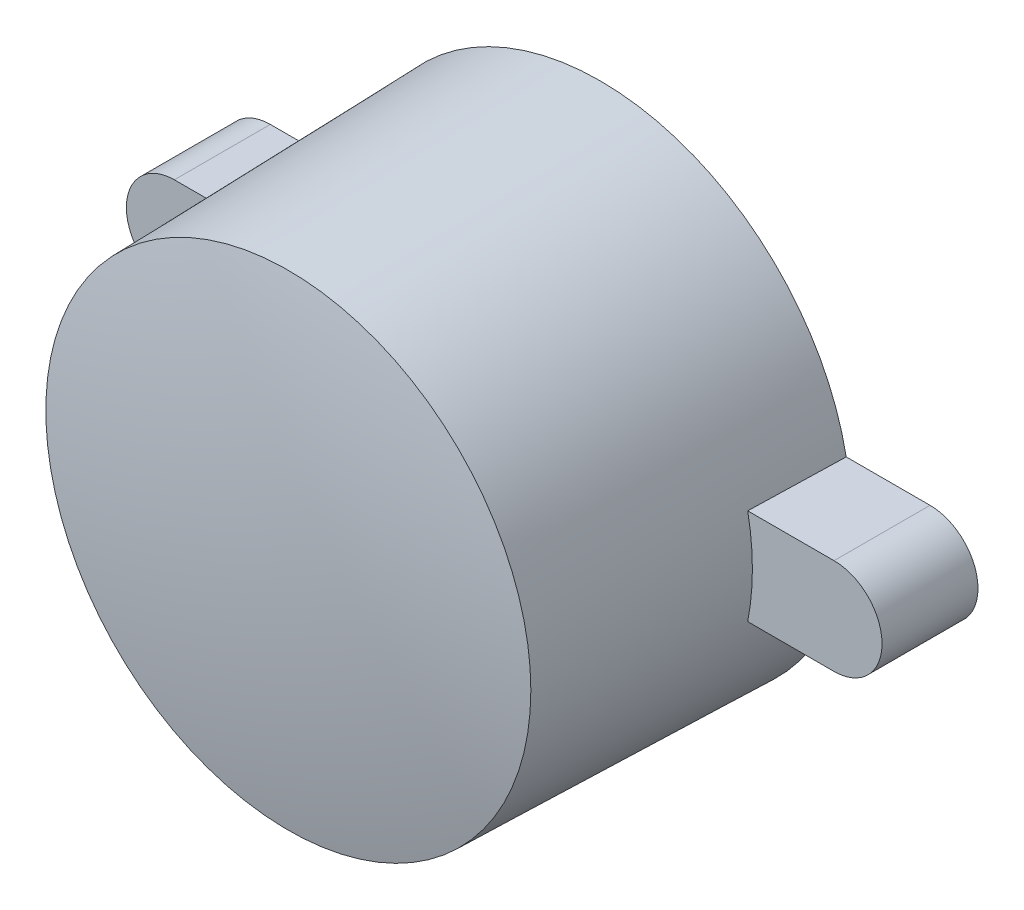
ISO-10303-21;
HEADER;
FILE_DESCRIPTION(('STEP AP214'),'2;1');
FILE_NAME('part.step','',(''),(''),'','','');
FILE_SCHEMA(('AUTOMOTIVE_DESIGN { 1 0 10303 214 1 1 1 1 }'));
ENDSEC;
DATA;
#1=APPLICATION_CONTEXT('core data for automotive mechanical design processes');
#2=APPLICATION_PROTOCOL_DEFINITION('international standard','automotive_design',2000,#1);
#3=PRODUCT_CONTEXT('',#1,'mechanical');
#4=PRODUCT('Part','Part','',(#3));
#5=PRODUCT_RELATED_PRODUCT_CATEGORY('part','',(#4));
#6=PRODUCT_DEFINITION_FORMATION('','',#4);
#7=PRODUCT_DEFINITION_CONTEXT('part definition',#1,'design');
#8=PRODUCT_DEFINITION('design','',#6,#7);
#9=PRODUCT_DEFINITION_SHAPE('','',#8);
#10=(LENGTH_UNIT() NAMED_UNIT(*) SI_UNIT(.MILLI.,.METRE.));
#11=(NAMED_UNIT(*) PLANE_ANGLE_UNIT() SI_UNIT($,.RADIAN.));
#12=(NAMED_UNIT(*) SI_UNIT($,.STERADIAN.) SOLID_ANGLE_UNIT());
#13=UNCERTAINTY_MEASURE_WITH_UNIT(LENGTH_MEASURE(1.E-05),#10,'distance_accuracy_value','');
#14=(GEOMETRIC_REPRESENTATION_CONTEXT(3) GLOBAL_UNCERTAINTY_ASSIGNED_CONTEXT((#13)) GLOBAL_UNIT_ASSIGNED_CONTEXT((#10,
#11,#12)) REPRESENTATION_CONTEXT('',''));
#15=CARTESIAN_POINT('',(0.,0.,0.));
#16=DIRECTION('',(0.,0.,1.));
#17=DIRECTION('',(1.,0.,0.));
#18=AXIS2_PLACEMENT_3D('',#15,#16,#17);
#19=CARTESIAN_POINT('',(0.,0.,0.));
#20=DIRECTION('',(0.,0.,-1.));
#21=DIRECTION('',(1.,0.,0.));
#22=AXIS2_PLACEMENT_3D('',#19,#20,#21);
#23=CONICAL_SURFACE('',#22,5.22500000000001,0.026179938779915);
#24=CARTESIAN_POINT('',(0.,0.,6.5));
#25=DIRECTION('',(0.,0.,1.));
#26=DIRECTION('',(1.,0.,0.));
#27=AXIS2_PLACEMENT_3D('',#24,#25,#26);
#28=CIRCLE('',#27,5.05479150980029);
#29=CARTESIAN_POINT('',(5.05479150980029,0.,6.5));
#30=VERTEX_POINT('',#29);
#31=EDGE_CURVE('E183',#30,#30,#28,.T.);
#32=ORIENTED_EDGE('',*,*,#31,.F.);
#33=EDGE_LOOP('',(#32));
#34=FACE_BOUND('',#33,.T.);
#35=CARTESIAN_POINT('',(0.,0.,2.));
#36=DIRECTION('',(0.,0.,-1.));
#37=DIRECTION('',(-1.,0.,0.));
#38=AXIS2_PLACEMENT_3D('',#35,#36,#37);
#39=CIRCLE('',#38,5.17262815686163);
#40=CARTESIAN_POINT('',(-5.0750450292739,-0.999999999999997,2.));
#41=VERTEX_POINT('',#40);
#42=CARTESIAN_POINT('',(-5.07504502927391,1.,2.));
#43=VERTEX_POINT('',#42);
#44=EDGE_CURVE('E11',#41,#43,#39,.T.);
#45=ORIENTED_EDGE('',*,*,#44,.F.);
#46=CARTESIAN_POINT('',(-4.98771234034426,-0.999999999999998,5.27111321483177));
#47=CARTESIAN_POINT('',(-5.03237903859328,-0.999999999999998,3.59860096085771));
#48=CARTESIAN_POINT('',(-5.07702432137998,-0.999999999999998,1.92608813550363));
#49=CARTESIAN_POINT('',(-5.16627205602835,-0.999999999999998,-1.41893865795026));
#50=CARTESIAN_POINT('',(-5.21087450789002,-0.999999999999998,-3.09145262605006));
#51=CARTESIAN_POINT('',(-5.25545554428937,-0.999999999999998,-4.76396716552988));
#52=B_SPLINE_CURVE_WITH_KNOTS('',3,(#46,#47,#48,#49,#50,#51),.UNSPECIFIED.,.F.,.F.,(4,2,4),(0.,
5.01932576849132,10.0386515369396),.UNSPECIFIED.);
#53=CARTESIAN_POINT('',(-5.12841349736935,-0.999999999999998,0.));
#54=VERTEX_POINT('',#53);
#55=EDGE_CURVE('E131',#41,#54,#52,.T.);
#56=ORIENTED_EDGE('',*,*,#55,.T.);
#57=CARTESIAN_POINT('',(0.,0.,0.));
#58=DIRECTION('',(0.,0.,1.));
#59=DIRECTION('',(1.,0.,0.));
#60=AXIS2_PLACEMENT_3D('',#57,#58,#59);
#61=CIRCLE('',#60,5.22500000000001);
#62=CARTESIAN_POINT('',(5.12841349736935,-1.,0.));
#63=VERTEX_POINT('',#62);
#64=EDGE_CURVE('E178',#54,#63,#61,.T.);
#65=ORIENTED_EDGE('',*,*,#64,.T.);
#66=CARTESIAN_POINT('',(5.25545554428937,-1.,-4.76396716552988));
#67=CARTESIAN_POINT('',(5.21087450789002,-1.,-3.09145262605006));
#68=CARTESIAN_POINT('',(5.16627205602835,-1.,-1.41893865795025));
#69=CARTESIAN_POINT('',(5.07702432137998,-1.,1.92608813550363));
#70=CARTESIAN_POINT('',(5.03237903859328,-1.,3.59860096085771));
#71=CARTESIAN_POINT('',(4.98771234034426,-1.,5.27111321483177));
#72=B_SPLINE_CURVE_WITH_KNOTS('',3,(#66,#67,#68,#69,#70,#71),.UNSPECIFIED.,.F.,.F.,(4,2,4),(0.,
5.0193257684483,10.0386515369396),.UNSPECIFIED.);
#73=CARTESIAN_POINT('',(5.0750450292739,-0.999999999999999,2.));
#74=VERTEX_POINT('',#73);
#75=EDGE_CURVE('E170',#63,#74,#72,.T.);
#76=ORIENTED_EDGE('',*,*,#75,.T.);
#77=CARTESIAN_POINT('',(0.,0.,2.));
#78=DIRECTION('',(0.,0.,-1.));
#79=DIRECTION('',(-1.,0.,0.));
#80=AXIS2_PLACEMENT_3D('',#77,#78,#79);
#81=CIRCLE('',#80,5.17262815686163);
#82=CARTESIAN_POINT('',(5.07504502927391,1.,2.));
#83=VERTEX_POINT('',#82);
#84=EDGE_CURVE('E41',#83,#74,#81,.T.);
#85=ORIENTED_EDGE('',*,*,#84,.F.);
#86=CARTESIAN_POINT('',(4.98771234034426,1.,5.27111321483177));
#87=CARTESIAN_POINT('',(5.03237903859328,1.,3.59860096085771));
#88=CARTESIAN_POINT('',(5.07702432137998,1.,1.92608813550363));
#89=CARTESIAN_POINT('',(5.16627205602835,1.,-1.41893865795026));
#90=CARTESIAN_POINT('',(5.21087450789002,1.,-3.09145262605006));
#91=CARTESIAN_POINT('',(5.25545554428937,1.,-4.76396716552988));
#92=B_SPLINE_CURVE_WITH_KNOTS('',3,(#86,#87,#88,#89,#90,#91),.UNSPECIFIED.,.F.,.F.,(4,2,4),(0.,
5.01932576849132,10.0386515369396),.UNSPECIFIED.);
#93=CARTESIAN_POINT('',(5.12841349736934,1.,0.));
#94=VERTEX_POINT('',#93);
#95=EDGE_CURVE('E162',#83,#94,#92,.T.);
#96=ORIENTED_EDGE('',*,*,#95,.T.);
#97=CARTESIAN_POINT('',(-5.12841349736934,1.,0.));
#98=VERTEX_POINT('',#97);
#99=EDGE_CURVE('E181',#94,#98,#61,.T.);
#100=ORIENTED_EDGE('',*,*,#99,.T.);
#101=CARTESIAN_POINT('',(-5.25545554428937,1.,-4.76396716552988));
#102=CARTESIAN_POINT('',(-5.21087450789002,1.,-3.09145262605006));
#103=CARTESIAN_POINT('',(-5.16627205602835,1.,-1.41893865795025));
#104=CARTESIAN_POINT('',(-5.07702432137998,1.,1.92608813550363));
#105=CARTESIAN_POINT('',(-5.03237903859328,1.,3.59860096085771));
#106=CARTESIAN_POINT('',(-4.98771234034426,1.,5.27111321483177));
#107=B_SPLINE_CURVE_WITH_KNOTS('',3,(#101,#102,#103,#104,#105,#106),.UNSPECIFIED.,.F.,.F.,(4,2,
4),(0.,5.0193257684483,10.0386515369396),.UNSPECIFIED.);
#108=EDGE_CURVE('E48',#98,#43,#107,.T.);
#109=ORIENTED_EDGE('',*,*,#108,.T.);
#110=EDGE_LOOP('',(#45,#56,#65,#76,#85,#96,#100,#109));
#111=FACE_BOUND('',#110,.T.);
#112=ADVANCED_FACE('F33',(#34,#111),#23,.T.);
#113=CARTESIAN_POINT('',(0.,0.,-18.8009172075491));
#114=DIRECTION('',(0.,0.,1.));
#115=DIRECTION('',(1.,0.,0.));
#116=AXIS2_PLACEMENT_3D('',#113,#114,#115);
#117=SPHERICAL_SURFACE('',#116,25.8009172075491);
#118=ORIENTED_EDGE('',*,*,#31,.T.);
#119=EDGE_LOOP('',(#118));
#120=FACE_BOUND('',#119,.T.);
#121=ADVANCED_FACE('F35',(#120),#117,.T.);
#122=CARTESIAN_POINT('',(0.,0.,0.));
#123=DIRECTION('',(0.,0.,1.));
#124=DIRECTION('',(1.,0.,0.));
#125=AXIS2_PLACEMENT_3D('',#122,#123,#124);
#126=PLANE('',#125);
#127=CARTESIAN_POINT('',(0.,0.,0.));
#128=DIRECTION('',(0.,0.,1.));
#129=DIRECTION('',(1.,0.,0.));
#130=AXIS2_PLACEMENT_3D('',#127,#128,#129);
#131=CIRCLE('',#130,3.47440011314099);
#132=CARTESIAN_POINT('',(3.47440011314099,0.,0.));
#133=VERTEX_POINT('',#132);
#134=EDGE_CURVE('E169',#133,#133,#131,.T.);
#135=ORIENTED_EDGE('',*,*,#134,.T.);
#136=EDGE_LOOP('',(#135));
#137=FACE_BOUND('',#136,.T.);
#138=ORIENTED_EDGE('',*,*,#64,.F.);
#139=DIRECTION('',(-1.,0.,0.));
#140=VECTOR('',#139,1.);
#141=CARTESIAN_POINT('',(-3.32737977186165,-0.999999999999998,0.));
#142=LINE('',#141,#140);
#143=CARTESIAN_POINT('',(-6.875,-0.999999999999997,0.));
#144=VERTEX_POINT('',#143);
#145=EDGE_CURVE('E117',#54,#144,#142,.T.);
#146=ORIENTED_EDGE('',*,*,#145,.T.);
#147=CARTESIAN_POINT('',(-6.875,0.,0.));
#148=DIRECTION('',(0.,0.,-1.));
#149=DIRECTION('',(-1.,0.,0.));
#150=AXIS2_PLACEMENT_3D('',#147,#148,#149);
#151=CIRCLE('',#150,1.);
#152=CARTESIAN_POINT('',(-6.875,1.,0.));
#153=VERTEX_POINT('',#152);
#154=EDGE_CURVE('E122',#144,#153,#151,.T.);
#155=ORIENTED_EDGE('',*,*,#154,.T.);
#156=DIRECTION('',(1.,0.,0.));
#157=VECTOR('',#156,1.);
#158=CARTESIAN_POINT('',(-3.32737977186165,1.,0.));
#159=LINE('',#158,#157);
#160=EDGE_CURVE('E100',#153,#98,#159,.T.);
#161=ORIENTED_EDGE('',*,*,#160,.T.);
#162=ORIENTED_EDGE('',*,*,#99,.F.);
#163=DIRECTION('',(1.,0.,0.));
#164=VECTOR('',#163,1.);
#165=CARTESIAN_POINT('',(6.875,1.,0.));
#166=LINE('',#165,#164);
#167=CARTESIAN_POINT('',(6.875,1.,0.));
#168=VERTEX_POINT('',#167);
#169=EDGE_CURVE('E202',#94,#168,#166,.T.);
#170=ORIENTED_EDGE('',*,*,#169,.T.);
#171=CARTESIAN_POINT('',(6.875,0.,0.));
#172=DIRECTION('',(0.,0.,-1.));
#173=DIRECTION('',(-1.,0.,0.));
#174=AXIS2_PLACEMENT_3D('',#171,#172,#173);
#175=CIRCLE('',#174,1.);
#176=CARTESIAN_POINT('',(6.875,-1.,0.));
#177=VERTEX_POINT('',#176);
#178=EDGE_CURVE('E204',#168,#177,#175,.T.);
#179=ORIENTED_EDGE('',*,*,#178,.T.);
#180=DIRECTION('',(-1.,0.,0.));
#181=VECTOR('',#180,1.);
#182=CARTESIAN_POINT('',(6.875,-1.,0.));
#183=LINE('',#182,#181);
#184=EDGE_CURVE('E207',#177,#63,#183,.T.);
#185=ORIENTED_EDGE('',*,*,#184,.T.);
#186=EDGE_LOOP('',(#138,#146,#155,#161,#162,#170,#179,#185));
#187=FACE_BOUND('',#186,.T.);
#188=ADVANCED_FACE('F216',(#137,#187),#126,.F.);
#189=CARTESIAN_POINT('',(0.,0.,-0.0458096595387781));
#190=DIRECTION('',(0.,0.,-1.));
#191=DIRECTION('',(1.,0.,0.));
#192=AXIS2_PLACEMENT_3D('',#189,#190,#191);
#193=CONICAL_SURFACE('',#192,3.47559968129278,0.026179938779915);
#194=CARTESIAN_POINT('',(0.,0.,5.01652844704856));
#195=DIRECTION('',(0.,0.,-1.));
#196=DIRECTION('',(-1.,0.,0.));
#197=AXIS2_PLACEMENT_3D('',#194,#195,#196);
#198=CIRCLE('',#197,3.34303769267698);
#199=CARTESIAN_POINT('',(-3.34303769267698,0.,5.01652844704856));
#200=VERTEX_POINT('',#199);
#201=EDGE_CURVE('E175',#200,#200,#198,.F.);
#202=ORIENTED_EDGE('',*,*,#201,.T.);
#203=EDGE_LOOP('',(#202));
#204=FACE_BOUND('',#203,.T.);
#205=ORIENTED_EDGE('',*,*,#134,.F.);
#206=EDGE_LOOP('',(#205));
#207=FACE_BOUND('',#206,.T.);
#208=ADVANCED_FACE('F233',(#204,#207),#193,.F.);
#209=CARTESIAN_POINT('',(0.,0.,-18.8009172075491));
#210=DIRECTION('',(0.,0.,1.));
#211=DIRECTION('',(1.,0.,0.));
#212=AXIS2_PLACEMENT_3D('',#209,#210,#211);
#213=SPHERICAL_SURFACE('',#212,24.0509172075491);
#214=ORIENTED_EDGE('',*,*,#201,.F.);
#215=EDGE_LOOP('',(#214));
#216=FACE_BOUND('',#215,.T.);
#217=ADVANCED_FACE('F157',(#216),#213,.F.);
#218=CARTESIAN_POINT('',(6.875,1.,2.));
#219=DIRECTION('',(0.,1.,0.));
#220=DIRECTION('',(-1.,0.,0.));
#221=AXIS2_PLACEMENT_3D('',#218,#219,#220);
#222=PLANE('',#221);
#223=ORIENTED_EDGE('',*,*,#95,.F.);
#224=DIRECTION('',(1.,0.,0.));
#225=VECTOR('',#224,1.);
#226=CARTESIAN_POINT('',(6.875,1.,2.));
#227=LINE('',#226,#225);
#228=CARTESIAN_POINT('',(6.875,1.,2.));
#229=VERTEX_POINT('',#228);
#230=EDGE_CURVE('E192',#83,#229,#227,.T.);
#231=ORIENTED_EDGE('',*,*,#230,.T.);
#232=DIRECTION('',(0.,0.,-1.));
#233=VECTOR('',#232,1.);
#234=CARTESIAN_POINT('',(6.875,1.,2.));
#235=LINE('',#234,#233);
#236=EDGE_CURVE('E210',#229,#168,#235,.T.);
#237=ORIENTED_EDGE('',*,*,#236,.T.);
#238=ORIENTED_EDGE('',*,*,#169,.F.);
#239=EDGE_LOOP('',(#223,#231,#237,#238));
#240=FACE_BOUND('',#239,.T.);
#241=ADVANCED_FACE('F152',(#240),#222,.T.);
#242=CARTESIAN_POINT('',(6.875,-1.,2.));
#243=DIRECTION('',(0.,-1.,0.));
#244=DIRECTION('',(1.,0.,0.));
#245=AXIS2_PLACEMENT_3D('',#242,#243,#244);
#246=PLANE('',#245);
#247=ORIENTED_EDGE('',*,*,#75,.F.);
#248=ORIENTED_EDGE('',*,*,#184,.F.);
#249=DIRECTION('',(0.,0.,-1.));
#250=VECTOR('',#249,1.);
#251=CARTESIAN_POINT('',(6.875,-1.,2.));
#252=LINE('',#251,#250);
#253=CARTESIAN_POINT('',(6.875,-1.,2.));
#254=VERTEX_POINT('',#253);
#255=EDGE_CURVE('E198',#254,#177,#252,.T.);
#256=ORIENTED_EDGE('',*,*,#255,.F.);
#257=DIRECTION('',(-1.,0.,0.));
#258=VECTOR('',#257,1.);
#259=CARTESIAN_POINT('',(6.875,-1.,2.));
#260=LINE('',#259,#258);
#261=EDGE_CURVE('E190',#254,#74,#260,.T.);
#262=ORIENTED_EDGE('',*,*,#261,.T.);
#263=EDGE_LOOP('',(#247,#248,#256,#262));
#264=FACE_BOUND('',#263,.T.);
#265=ADVANCED_FACE('F156',(#264),#246,.T.);
#266=CARTESIAN_POINT('',(6.875,0.,2.));
#267=DIRECTION('',(0.,0.,-1.));
#268=DIRECTION('',(-1.,0.,0.));
#269=AXIS2_PLACEMENT_3D('',#266,#267,#268);
#270=CYLINDRICAL_SURFACE('',#269,1.);
#271=ORIENTED_EDGE('',*,*,#178,.F.);
#272=ORIENTED_EDGE('',*,*,#236,.F.);
#273=CARTESIAN_POINT('',(6.875,0.,2.));
#274=DIRECTION('',(0.,0.,-1.));
#275=DIRECTION('',(-1.,0.,0.));
#276=AXIS2_PLACEMENT_3D('',#273,#274,#275);
#277=CIRCLE('',#276,1.);
#278=EDGE_CURVE('E199',#229,#254,#277,.T.);
#279=ORIENTED_EDGE('',*,*,#278,.T.);
#280=ORIENTED_EDGE('',*,*,#255,.T.);
#281=EDGE_LOOP('',(#271,#272,#279,#280));
#282=FACE_BOUND('',#281,.T.);
#283=ADVANCED_FACE('F150',(#282),#270,.T.);
#284=CARTESIAN_POINT('',(6.875,0.,2.));
#285=DIRECTION('',(0.,0.,-1.));
#286=DIRECTION('',(-1.,0.,0.));
#287=AXIS2_PLACEMENT_3D('',#284,#285,#286);
#288=PLANE('',#287);
#289=ORIENTED_EDGE('',*,*,#230,.F.);
#290=ORIENTED_EDGE('',*,*,#84,.T.);
#291=ORIENTED_EDGE('',*,*,#261,.F.);
#292=ORIENTED_EDGE('',*,*,#278,.F.);
#293=EDGE_LOOP('',(#289,#290,#291,#292));
#294=FACE_BOUND('',#293,.T.);
#295=ADVANCED_FACE('F147',(#294),#288,.F.);
#296=CARTESIAN_POINT('',(-3.32737977186165,-0.999999999999998,2.));
#297=DIRECTION('',(0.,-1.,0.));
#298=DIRECTION('',(1.,0.,0.));
#299=AXIS2_PLACEMENT_3D('',#296,#297,#298);
#300=PLANE('',#299);
#301=ORIENTED_EDGE('',*,*,#55,.F.);
#302=DIRECTION('',(-1.,0.,0.));
#303=VECTOR('',#302,1.);
#304=CARTESIAN_POINT('',(-3.32737977186165,-0.999999999999998,2.));
#305=LINE('',#304,#303);
#306=CARTESIAN_POINT('',(-6.875,-0.999999999999997,2.));
#307=VERTEX_POINT('',#306);
#308=EDGE_CURVE('E106',#41,#307,#305,.T.);
#309=ORIENTED_EDGE('',*,*,#308,.T.);
#310=DIRECTION('',(0.,0.,-1.));
#311=VECTOR('',#310,1.);
#312=CARTESIAN_POINT('',(-6.875,-0.999999999999997,2.));
#313=LINE('',#312,#311);
#314=EDGE_CURVE('E105',#307,#144,#313,.T.);
#315=ORIENTED_EDGE('',*,*,#314,.T.);
#316=ORIENTED_EDGE('',*,*,#145,.F.);
#317=EDGE_LOOP('',(#301,#309,#315,#316));
#318=FACE_BOUND('',#317,.T.);
#319=ADVANCED_FACE('F142',(#318),#300,.T.);
#320=CARTESIAN_POINT('',(-3.32737977186165,1.,2.));
#321=DIRECTION('',(0.,1.,0.));
#322=DIRECTION('',(-1.,0.,0.));
#323=AXIS2_PLACEMENT_3D('',#320,#321,#322);
#324=PLANE('',#323);
#325=ORIENTED_EDGE('',*,*,#108,.F.);
#326=ORIENTED_EDGE('',*,*,#160,.F.);
#327=DIRECTION('',(0.,0.,-1.));
#328=VECTOR('',#327,1.);
#329=CARTESIAN_POINT('',(-6.875,1.,2.));
#330=LINE('',#329,#328);
#331=CARTESIAN_POINT('',(-6.875,1.,2.));
#332=VERTEX_POINT('',#331);
#333=EDGE_CURVE('E95',#332,#153,#330,.T.);
#334=ORIENTED_EDGE('',*,*,#333,.F.);
#335=DIRECTION('',(1.,0.,0.));
#336=VECTOR('',#335,1.);
#337=CARTESIAN_POINT('',(-3.32737977186165,1.,2.));
#338=LINE('',#337,#336);
#339=EDGE_CURVE('E98',#332,#43,#338,.T.);
#340=ORIENTED_EDGE('',*,*,#339,.T.);
#341=EDGE_LOOP('',(#325,#326,#334,#340));
#342=FACE_BOUND('',#341,.T.);
#343=ADVANCED_FACE('F97',(#342),#324,.T.);
#344=CARTESIAN_POINT('',(-6.875,0.,2.));
#345=DIRECTION('',(0.,0.,-1.));
#346=DIRECTION('',(-1.,0.,0.));
#347=AXIS2_PLACEMENT_3D('',#344,#345,#346);
#348=CYLINDRICAL_SURFACE('',#347,1.);
#349=ORIENTED_EDGE('',*,*,#154,.F.);
#350=ORIENTED_EDGE('',*,*,#314,.F.);
#351=CARTESIAN_POINT('',(-6.875,0.,2.));
#352=DIRECTION('',(0.,0.,-1.));
#353=DIRECTION('',(-1.,0.,0.));
#354=AXIS2_PLACEMENT_3D('',#351,#352,#353);
#355=CIRCLE('',#354,1.);
#356=EDGE_CURVE('E112',#307,#332,#355,.T.);
#357=ORIENTED_EDGE('',*,*,#356,.T.);
#358=ORIENTED_EDGE('',*,*,#333,.T.);
#359=EDGE_LOOP('',(#349,#350,#357,#358));
#360=FACE_BOUND('',#359,.T.);
#361=ADVANCED_FACE('F115',(#360),#348,.T.);
#362=CARTESIAN_POINT('',(-6.875,0.,2.));
#363=DIRECTION('',(0.,0.,-1.));
#364=DIRECTION('',(-1.,0.,0.));
#365=AXIS2_PLACEMENT_3D('',#362,#363,#364);
#366=PLANE('',#365);
#367=ORIENTED_EDGE('',*,*,#308,.F.);
#368=ORIENTED_EDGE('',*,*,#44,.T.);
#369=ORIENTED_EDGE('',*,*,#339,.F.);
#370=ORIENTED_EDGE('',*,*,#356,.F.);
#371=EDGE_LOOP('',(#367,#368,#369,#370));
#372=FACE_BOUND('',#371,.T.);
#373=ADVANCED_FACE('F111',(#372),#366,.F.);
#374=CLOSED_SHELL('',(#112,#121,#188,#208,#217,#241,#265,#283,#295,#319,#343,#361,#373));
#375=MANIFOLD_SOLID_BREP('B2',#374);
#376=ADVANCED_BREP_SHAPE_REPRESENTATION('',(#18,#375),#14);
#377=SHAPE_DEFINITION_REPRESENTATION(#9,#376);
ENDSEC;
END-ISO-10303-21;
